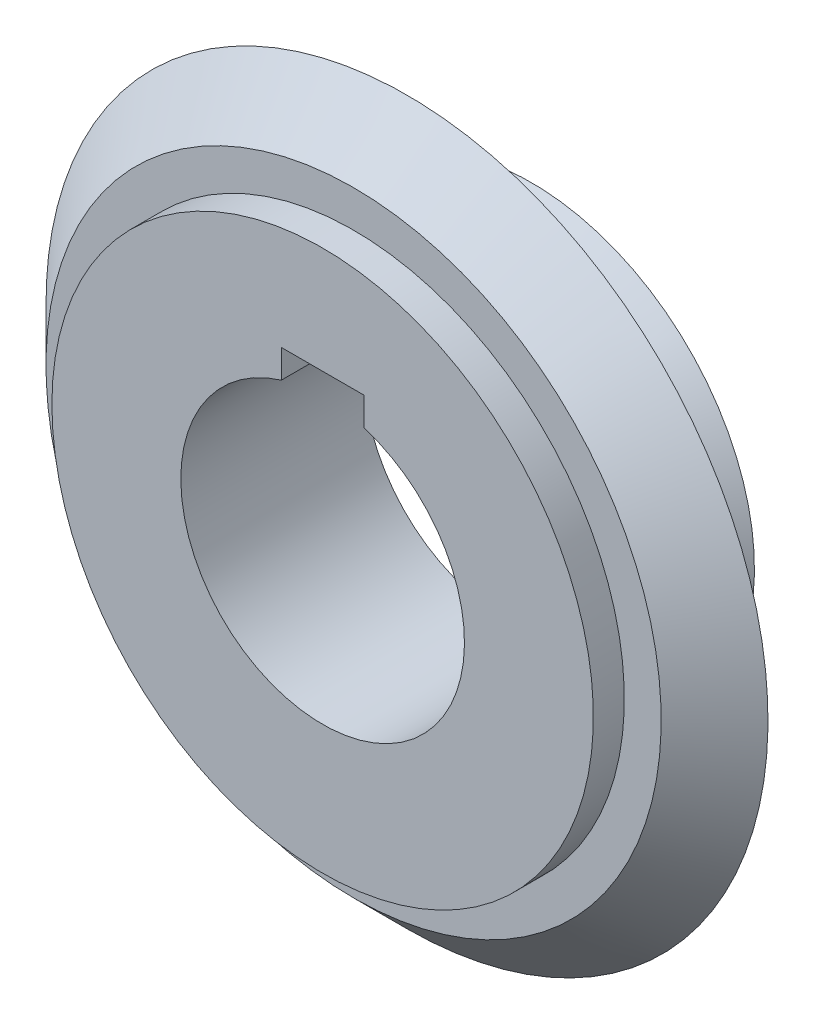
ISO-10303-21;
HEADER;
FILE_DESCRIPTION(('STEP AP214'),'2;1');
FILE_NAME('part.step','',(''),(''),'','','');
FILE_SCHEMA(('AUTOMOTIVE_DESIGN { 1 0 10303 214 1 1 1 1 }'));
ENDSEC;
DATA;
#1=APPLICATION_CONTEXT('core data for automotive mechanical design processes');
#2=APPLICATION_PROTOCOL_DEFINITION('international standard','automotive_design',2000,#1);
#3=PRODUCT_CONTEXT('',#1,'mechanical');
#4=PRODUCT('Part','Part','',(#3));
#5=PRODUCT_RELATED_PRODUCT_CATEGORY('part','',(#4));
#6=PRODUCT_DEFINITION_FORMATION('','',#4);
#7=PRODUCT_DEFINITION_CONTEXT('part definition',#1,'design');
#8=PRODUCT_DEFINITION('design','',#6,#7);
#9=PRODUCT_DEFINITION_SHAPE('','',#8);
#10=(LENGTH_UNIT() NAMED_UNIT(*) SI_UNIT(.MILLI.,.METRE.));
#11=(NAMED_UNIT(*) PLANE_ANGLE_UNIT() SI_UNIT($,.RADIAN.));
#12=(NAMED_UNIT(*) SI_UNIT($,.STERADIAN.) SOLID_ANGLE_UNIT());
#13=UNCERTAINTY_MEASURE_WITH_UNIT(LENGTH_MEASURE(1.E-05),#10,'distance_accuracy_value','');
#14=(GEOMETRIC_REPRESENTATION_CONTEXT(3) GLOBAL_UNCERTAINTY_ASSIGNED_CONTEXT((#13)) GLOBAL_UNIT_ASSIGNED_CONTEXT((#10,
#11,#12)) REPRESENTATION_CONTEXT('',''));
#15=CARTESIAN_POINT('',(0.,0.,0.));
#16=DIRECTION('',(0.,0.,1.));
#17=DIRECTION('',(1.,0.,0.));
#18=AXIS2_PLACEMENT_3D('',#15,#16,#17);
#19=CARTESIAN_POINT('',(-8.,26.310644234,38.991406548));
#20=DIRECTION('',(1.,0.,0.));
#21=DIRECTION('',(0.,1.,0.));
#22=AXIS2_PLACEMENT_3D('',#19,#20,#21);
#23=PLANE('',#22);
#24=DIRECTION('',(0.,0.,1.));
#25=VECTOR('',#24,1.);
#26=CARTESIAN_POINT('',(-8.,26.310644234,43.991406548));
#27=LINE('',#26,#25);
#28=CARTESIAN_POINT('',(-8.,26.310644234,43.991406548));
#29=VERTEX_POINT('',#28);
#30=CARTESIAN_POINT('',(-8.,26.310644234,79.491406548));
#31=VERTEX_POINT('',#30);
#32=EDGE_CURVE('E246',#29,#31,#27,.T.);
#33=ORIENTED_EDGE('',*,*,#32,.F.);
#34=DIRECTION('',(0.,1.,0.));
#35=VECTOR('',#34,1.);
#36=CARTESIAN_POINT('',(-8.,26.310644234,43.991406548));
#37=LINE('',#36,#35);
#38=CARTESIAN_POINT('',(-8.,31.8,43.991406548));
#39=VERTEX_POINT('',#38);
#40=EDGE_CURVE('E97',#29,#39,#37,.T.);
#41=ORIENTED_EDGE('',*,*,#40,.T.);
#42=DIRECTION('',(0.,0.,1.));
#43=VECTOR('',#42,1.);
#44=CARTESIAN_POINT('',(-8.,31.8,43.991406548));
#45=LINE('',#44,#43);
#46=CARTESIAN_POINT('',(-8.,31.8,79.491406548));
#47=VERTEX_POINT('',#46);
#48=EDGE_CURVE('E11',#39,#47,#45,.T.);
#49=ORIENTED_EDGE('',*,*,#48,.T.);
#50=DIRECTION('',(0.,1.,0.));
#51=VECTOR('',#50,1.);
#52=CARTESIAN_POINT('',(-8.,26.310644234,79.491406548));
#53=LINE('',#52,#51);
#54=EDGE_CURVE('E94',#31,#47,#53,.T.);
#55=ORIENTED_EDGE('',*,*,#54,.F.);
#56=EDGE_LOOP('',(#33,#41,#49,#55));
#57=FACE_BOUND('',#56,.T.);
#58=ADVANCED_FACE('F17',(#57),#23,.T.);
#59=CARTESIAN_POINT('',(8.,31.8,38.991406548));
#60=DIRECTION('',(0.,-1.,0.));
#61=DIRECTION('',(0.,0.,-1.));
#62=AXIS2_PLACEMENT_3D('',#59,#60,#61);
#63=PLANE('',#62);
#64=ORIENTED_EDGE('',*,*,#48,.F.);
#65=DIRECTION('',(1.,0.,0.));
#66=VECTOR('',#65,1.);
#67=CARTESIAN_POINT('',(-8.,31.8,43.991406548));
#68=LINE('',#67,#66);
#69=CARTESIAN_POINT('',(8.,31.8,43.991406548));
#70=VERTEX_POINT('',#69);
#71=EDGE_CURVE('E126',#39,#70,#68,.T.);
#72=ORIENTED_EDGE('',*,*,#71,.T.);
#73=DIRECTION('',(0.,0.,1.));
#74=VECTOR('',#73,1.);
#75=CARTESIAN_POINT('',(8.,31.8,43.991406548));
#76=LINE('',#75,#74);
#77=CARTESIAN_POINT('',(8.,31.8,79.491406548));
#78=VERTEX_POINT('',#77);
#79=EDGE_CURVE('E26',#70,#78,#76,.T.);
#80=ORIENTED_EDGE('',*,*,#79,.T.);
#81=DIRECTION('',(1.,0.,0.));
#82=VECTOR('',#81,1.);
#83=CARTESIAN_POINT('',(-8.,31.8,79.491406548));
#84=LINE('',#83,#82);
#85=EDGE_CURVE('E102',#47,#78,#84,.T.);
#86=ORIENTED_EDGE('',*,*,#85,.F.);
#87=EDGE_LOOP('',(#64,#72,#80,#86));
#88=FACE_BOUND('',#87,.T.);
#89=ADVANCED_FACE('F103',(#88),#63,.T.);
#90=CARTESIAN_POINT('',(8.,26.310644234,38.991406548));
#91=DIRECTION('',(-1.,0.,0.));
#92=DIRECTION('',(0.,0.,1.));
#93=AXIS2_PLACEMENT_3D('',#90,#91,#92);
#94=PLANE('',#93);
#95=ORIENTED_EDGE('',*,*,#79,.F.);
#96=DIRECTION('',(0.,-1.,0.));
#97=VECTOR('',#96,1.);
#98=CARTESIAN_POINT('',(8.,31.8,43.991406548));
#99=LINE('',#98,#97);
#100=CARTESIAN_POINT('',(8.,26.310644234,43.991406548));
#101=VERTEX_POINT('',#100);
#102=EDGE_CURVE('E131',#70,#101,#99,.T.);
#103=ORIENTED_EDGE('',*,*,#102,.T.);
#104=DIRECTION('',(0.,0.,1.));
#105=VECTOR('',#104,1.);
#106=CARTESIAN_POINT('',(8.,26.310644234,43.991406548));
#107=LINE('',#106,#105);
#108=CARTESIAN_POINT('',(8.,26.310644234,79.491406548));
#109=VERTEX_POINT('',#108);
#110=EDGE_CURVE('E251',#101,#109,#107,.T.);
#111=ORIENTED_EDGE('',*,*,#110,.T.);
#112=DIRECTION('',(0.,-1.,0.));
#113=VECTOR('',#112,1.);
#114=CARTESIAN_POINT('',(8.,31.8,79.491406548));
#115=LINE('',#114,#113);
#116=EDGE_CURVE('E107',#78,#109,#115,.T.);
#117=ORIENTED_EDGE('',*,*,#116,.F.);
#118=EDGE_LOOP('',(#95,#103,#111,#117));
#119=FACE_BOUND('',#118,.T.);
#120=ADVANCED_FACE('F206',(#119),#94,.T.);
#121=CARTESIAN_POINT('',(0.,27.5,43.991406548));
#122=DIRECTION('',(0.,0.,-1.));
#123=DIRECTION('',(0.,-1.,0.));
#124=AXIS2_PLACEMENT_3D('',#121,#122,#123);
#125=PLANE('',#124);
#126=ORIENTED_EDGE('',*,*,#71,.F.);
#127=ORIENTED_EDGE('',*,*,#40,.F.);
#128=CARTESIAN_POINT('',(0.,0.,43.991406548));
#129=DIRECTION('',(0.,0.,1.));
#130=DIRECTION('',(1.,0.,0.));
#131=AXIS2_PLACEMENT_3D('',#128,#129,#130);
#132=CIRCLE('',#131,27.5);
#133=EDGE_CURVE('E244',#29,#101,#132,.T.);
#134=ORIENTED_EDGE('',*,*,#133,.T.);
#135=ORIENTED_EDGE('',*,*,#102,.F.);
#136=EDGE_LOOP('',(#126,#127,#134,#135));
#137=FACE_BOUND('',#136,.T.);
#138=CARTESIAN_POINT('',(0.,0.,43.991406548));
#139=DIRECTION('',(0.,0.,1.));
#140=DIRECTION('',(1.,0.,0.));
#141=AXIS2_PLACEMENT_3D('',#138,#139,#140);
#142=CIRCLE('',#141,38.231455094);
#143=CARTESIAN_POINT('',(-30.9298968907286,-22.4718854779351,43.991406548));
#144=VERTEX_POINT('',#143);
#145=EDGE_CURVE('E84',#144,#144,#142,.T.);
#146=ORIENTED_EDGE('',*,*,#145,.F.);
#147=EDGE_LOOP('',(#146));
#148=FACE_BOUND('',#147,.T.);
#149=ADVANCED_FACE('F145',(#137,#148),#125,.T.);
#150=CARTESIAN_POINT('',(0.,52.5,79.491406548));
#151=DIRECTION('',(0.,0.,1.));
#152=DIRECTION('',(1.,0.,0.));
#153=AXIS2_PLACEMENT_3D('',#150,#151,#152);
#154=PLANE('',#153);
#155=CARTESIAN_POINT('',(0.,0.,79.491406548));
#156=DIRECTION('',(0.,0.,1.));
#157=DIRECTION('',(1.,0.,0.));
#158=AXIS2_PLACEMENT_3D('',#155,#156,#157);
#159=CIRCLE('',#158,27.5);
#160=EDGE_CURVE('E113',#31,#109,#159,.T.);
#161=ORIENTED_EDGE('',*,*,#160,.F.);
#162=ORIENTED_EDGE('',*,*,#54,.T.);
#163=ORIENTED_EDGE('',*,*,#85,.T.);
#164=ORIENTED_EDGE('',*,*,#116,.T.);
#165=EDGE_LOOP('',(#161,#162,#163,#164));
#166=FACE_BOUND('',#165,.T.);
#167=CARTESIAN_POINT('',(0.,0.,79.491406548));
#168=DIRECTION('',(0.,0.,1.));
#169=DIRECTION('',(1.,0.,0.));
#170=AXIS2_PLACEMENT_3D('',#167,#168,#169);
#171=CIRCLE('',#170,52.5);
#172=CARTESIAN_POINT('',(-52.5,0.,79.491406548));
#173=VERTEX_POINT('',#172);
#174=EDGE_CURVE('E264',#173,#173,#171,.T.);
#175=ORIENTED_EDGE('',*,*,#174,.T.);
#176=EDGE_LOOP('',(#175));
#177=FACE_BOUND('',#176,.T.);
#178=ADVANCED_FACE('F110',(#166,#177),#154,.T.);
#179=CARTESIAN_POINT('',(0.,59.64314334,73.491406548));
#180=DIRECTION('',(0.,0.,1.));
#181=DIRECTION('',(1.,0.,0.));
#182=AXIS2_PLACEMENT_3D('',#179,#180,#181);
#183=PLANE('',#182);
#184=CARTESIAN_POINT('',(0.,0.,73.491406548));
#185=DIRECTION('',(0.,0.,1.));
#186=DIRECTION('',(1.,0.,0.));
#187=AXIS2_PLACEMENT_3D('',#184,#185,#186);
#188=CIRCLE('',#187,52.5);
#189=CARTESIAN_POINT('',(-52.5,0.,73.491406548));
#190=VERTEX_POINT('',#189);
#191=EDGE_CURVE('E248',#190,#190,#188,.T.);
#192=ORIENTED_EDGE('',*,*,#191,.F.);
#193=EDGE_LOOP('',(#192));
#194=FACE_BOUND('',#193,.T.);
#195=CARTESIAN_POINT('',(0.,0.,73.491406548));
#196=DIRECTION('',(0.,0.,1.));
#197=DIRECTION('',(1.,0.,0.));
#198=AXIS2_PLACEMENT_3D('',#195,#196,#197);
#199=CIRCLE('',#198,59.64314334);
#200=CARTESIAN_POINT('',(-48.2523165600009,-35.057360055618,73.491406548));
#201=VERTEX_POINT('',#200);
#202=EDGE_CURVE('E259',#201,#201,#199,.T.);
#203=ORIENTED_EDGE('',*,*,#202,.T.);
#204=EDGE_LOOP('',(#203));
#205=FACE_BOUND('',#204,.T.);
#206=ADVANCED_FACE('F144',(#194,#205),#183,.T.);
#207=CARTESIAN_POINT('',(0.,0.,43.491406548));
#208=DIRECTION('',(0.,0.,-1.));
#209=DIRECTION('',(0.809016994374947,0.587785252292473,0.));
#210=AXIS2_PLACEMENT_3D('',#207,#208,#209);
#211=CONICAL_SURFACE('',#210,38.731455094,0.785398163397448);
#212=CARTESIAN_POINT('',(0.,0.,38.991406548));
#213=DIRECTION('',(0.,0.,1.));
#214=DIRECTION('',(1.,0.,0.));
#215=AXIS2_PLACEMENT_3D('',#212,#213,#214);
#216=CIRCLE('',#215,43.231455094);
#217=CARTESIAN_POINT('',(34.9749818626034,-25.4108117393975,38.9914065479999));
#218=VERTEX_POINT('',#217);
#219=CARTESIAN_POINT('',(-34.9749818626034,-25.4108117393975,38.991406548));
#220=VERTEX_POINT('',#219);
#221=EDGE_CURVE('E272',#218,#220,#216,.T.);
#222=ORIENTED_EDGE('',*,*,#221,.F.);
#223=CARTESIAN_POINT('',(0.,0.,38.991406548));
#224=DIRECTION('',(0.,0.,1.));
#225=DIRECTION('',(1.,0.,0.));
#226=AXIS2_PLACEMENT_3D('',#223,#224,#225);
#227=CIRCLE('',#226,43.231455094);
#228=EDGE_CURVE('E276',#220,#218,#227,.T.);
#229=ORIENTED_EDGE('',*,*,#228,.F.);
#230=DIRECTION('',(0.572061402817684,0.415626937777454,0.707106781186548));
#231=VECTOR('',#230,1.);
#232=CARTESIAN_POINT('',(-31.3344053879161,-22.7657781040814,43.491406548));
#233=LINE('',#232,#231);
#234=EDGE_CURVE('E119',#220,#144,#233,.T.);
#235=ORIENTED_EDGE('',*,*,#234,.T.);
#236=ORIENTED_EDGE('',*,*,#145,.T.);
#237=ORIENTED_EDGE('',*,*,#234,.F.);
#238=EDGE_LOOP('',(#222,#229,#235,#236,#237));
#239=FACE_BOUND('',#238,.T.);
#240=ADVANCED_FACE('F172',(#239),#211,.F.);
#241=CARTESIAN_POINT('',(0.,0.,60.7202355539999));
#242=DIRECTION('',(0.,0.,1.));
#243=DIRECTION('',(-0.809016994374947,0.587785252292473,0.));
#244=AXIS2_PLACEMENT_3D('',#241,#242,#243);
#245=CONICAL_SURFACE('',#244,67.3231455094,0.836920282917211);
#246=ORIENTED_EDGE('',*,*,#221,.T.);
#247=ORIENTED_EDGE('',*,*,#228,.T.);
#248=DIRECTION('',(0.600763071878818,-0.436479920975103,0.669752947027704));
#249=VECTOR('',#248,1.);
#250=CARTESIAN_POINT('',(54.465568831882,-39.5715520683655,60.7202355539999));
#251=LINE('',#250,#249);
#252=CARTESIAN_POINT('',(56.6311896062464,-41.1449676604731,63.134549888));
#253=VERTEX_POINT('',#252);
#254=EDGE_CURVE('E282',#218,#253,#251,.T.);
#255=ORIENTED_EDGE('',*,*,#254,.T.);
#256=CARTESIAN_POINT('',(0.,0.,63.134549888));
#257=DIRECTION('',(0.,0.,1.));
#258=DIRECTION('',(1.,0.,0.));
#259=AXIS2_PLACEMENT_3D('',#256,#257,#258);
#260=CIRCLE('',#259,70.);
#261=CARTESIAN_POINT('',(-56.6311896062463,-41.1449676604731,63.134549888));
#262=VERTEX_POINT('',#261);
#263=EDGE_CURVE('E262',#262,#253,#260,.T.);
#264=ORIENTED_EDGE('',*,*,#263,.F.);
#265=CARTESIAN_POINT('',(0.,0.,63.134549888));
#266=DIRECTION('',(0.,0.,1.));
#267=DIRECTION('',(1.,0.,0.));
#268=AXIS2_PLACEMENT_3D('',#265,#266,#267);
#269=CIRCLE('',#268,70.);
#270=EDGE_CURVE('E267',#253,#262,#269,.T.);
#271=ORIENTED_EDGE('',*,*,#270,.F.);
#272=ORIENTED_EDGE('',*,*,#254,.F.);
#273=EDGE_LOOP('',(#246,#247,#255,#264,#271,#272));
#274=FACE_BOUND('',#273,.T.);
#275=ADVANCED_FACE('F177',(#274),#245,.T.);
#276=CARTESIAN_POINT('',(0.,0.,64.1702355539999));
#277=DIRECTION('',(0.,0.,-1.));
#278=DIRECTION('',(0.809016994374948,0.587785252292473,0.));
#279=AXIS2_PLACEMENT_3D('',#276,#277,#278);
#280=CONICAL_SURFACE('',#279,68.964314334,0.785398163397448);
#281=ORIENTED_EDGE('',*,*,#270,.T.);
#282=DIRECTION('',(0.572061402817684,0.415626937777453,0.707106781186548));
#283=VECTOR('',#282,1.);
#284=CARTESIAN_POINT('',(-55.7933023016218,-40.5362068999876,64.1702355539999));
#285=LINE('',#284,#283);
#286=EDGE_CURVE('E263',#262,#201,#285,.T.);
#287=ORIENTED_EDGE('',*,*,#286,.T.);
#288=ORIENTED_EDGE('',*,*,#202,.F.);
#289=ORIENTED_EDGE('',*,*,#286,.F.);
#290=ORIENTED_EDGE('',*,*,#263,.T.);
#291=EDGE_LOOP('',(#281,#287,#288,#289,#290));
#292=FACE_BOUND('',#291,.T.);
#293=ADVANCED_FACE('F166',(#292),#280,.T.);
#294=CARTESIAN_POINT('',(0.,0.,76.491406548));
#295=DIRECTION('',(0.,0.,1.));
#296=DIRECTION('',(1.,0.,0.));
#297=AXIS2_PLACEMENT_3D('',#294,#295,#296);
#298=CYLINDRICAL_SURFACE('',#297,52.5);
#299=ORIENTED_EDGE('',*,*,#191,.T.);
#300=DIRECTION('',(0.,0.,1.));
#301=VECTOR('',#300,1.);
#302=CARTESIAN_POINT('',(-52.5,0.,76.491406548));
#303=LINE('',#302,#301);
#304=EDGE_CURVE('E268',#190,#173,#303,.T.);
#305=ORIENTED_EDGE('',*,*,#304,.T.);
#306=ORIENTED_EDGE('',*,*,#174,.F.);
#307=ORIENTED_EDGE('',*,*,#304,.F.);
#308=EDGE_LOOP('',(#299,#305,#306,#307));
#309=FACE_BOUND('',#308,.T.);
#310=ADVANCED_FACE('F157',(#309),#298,.T.);
#311=CARTESIAN_POINT('',(0.,0.,61.741406548));
#312=DIRECTION('',(0.,0.,1.));
#313=DIRECTION('',(0.,-1.,0.));
#314=AXIS2_PLACEMENT_3D('',#311,#312,#313);
#315=CYLINDRICAL_SURFACE('',#314,27.5);
#316=ORIENTED_EDGE('',*,*,#160,.T.);
#317=ORIENTED_EDGE('',*,*,#110,.F.);
#318=ORIENTED_EDGE('',*,*,#133,.F.);
#319=ORIENTED_EDGE('',*,*,#32,.T.);
#320=EDGE_LOOP('',(#316,#317,#318,#319));
#321=FACE_BOUND('',#320,.T.);
#322=ADVANCED_FACE('F152',(#321),#315,.F.);
#323=CLOSED_SHELL('',(#58,#89,#120,#149,#178,#206,#240,#275,#293,#310,#322));
#324=MANIFOLD_SOLID_BREP('B1',#323);
#325=ADVANCED_BREP_SHAPE_REPRESENTATION('',(#18,#324),#14);
#326=SHAPE_DEFINITION_REPRESENTATION(#9,#325);
ENDSEC;
END-ISO-10303-21;
